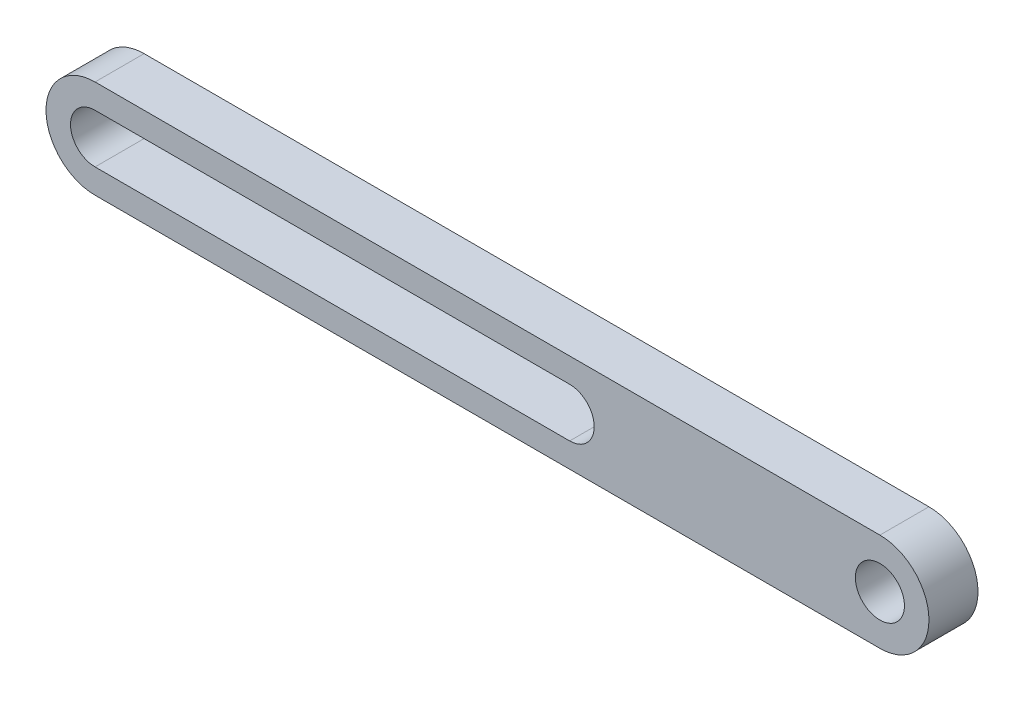
ISO-10303-21;
HEADER;
FILE_DESCRIPTION(('STEP AP214'),'2;1');
FILE_NAME('part.step','',(''),(''),'','','');
FILE_SCHEMA(('AUTOMOTIVE_DESIGN { 1 0 10303 214 1 1 1 1 }'));
ENDSEC;
DATA;
#1=APPLICATION_CONTEXT('core data for automotive mechanical design processes');
#2=APPLICATION_PROTOCOL_DEFINITION('international standard','automotive_design',2000,#1);
#3=PRODUCT_CONTEXT('',#1,'mechanical');
#4=PRODUCT('Part','Part','',(#3));
#5=PRODUCT_RELATED_PRODUCT_CATEGORY('part','',(#4));
#6=PRODUCT_DEFINITION_FORMATION('','',#4);
#7=PRODUCT_DEFINITION_CONTEXT('part definition',#1,'design');
#8=PRODUCT_DEFINITION('design','',#6,#7);
#9=PRODUCT_DEFINITION_SHAPE('','',#8);
#10=(LENGTH_UNIT() NAMED_UNIT(*) SI_UNIT(.MILLI.,.METRE.));
#11=(NAMED_UNIT(*) PLANE_ANGLE_UNIT() SI_UNIT($,.RADIAN.));
#12=(NAMED_UNIT(*) SI_UNIT($,.STERADIAN.) SOLID_ANGLE_UNIT());
#13=UNCERTAINTY_MEASURE_WITH_UNIT(LENGTH_MEASURE(1.E-05),#10,'distance_accuracy_value','');
#14=(GEOMETRIC_REPRESENTATION_CONTEXT(3) GLOBAL_UNCERTAINTY_ASSIGNED_CONTEXT((#13)) GLOBAL_UNIT_ASSIGNED_CONTEXT((#10,
#11,#12)) REPRESENTATION_CONTEXT('',''));
#15=CARTESIAN_POINT('',(0.,0.,0.));
#16=DIRECTION('',(0.,0.,1.));
#17=DIRECTION('',(1.,0.,0.));
#18=AXIS2_PLACEMENT_3D('',#15,#16,#17);
#19=CARTESIAN_POINT('',(0.,-5.,5.));
#20=DIRECTION('',(0.,0.,-1.));
#21=DIRECTION('',(-1.,0.,0.));
#22=AXIS2_PLACEMENT_3D('',#19,#20,#21);
#23=CYLINDRICAL_SURFACE('',#22,5.);
#24=CARTESIAN_POINT('',(0.,-5.,0.));
#25=DIRECTION('',(0.,0.,1.));
#26=DIRECTION('',(1.,0.,0.));
#27=AXIS2_PLACEMENT_3D('',#24,#25,#26);
#28=CIRCLE('',#27,5.);
#29=CARTESIAN_POINT('',(0.,0.,0.));
#30=VERTEX_POINT('',#29);
#31=CARTESIAN_POINT('',(0.,-10.,0.));
#32=VERTEX_POINT('',#31);
#33=EDGE_CURVE('E156',#30,#32,#28,.T.);
#34=ORIENTED_EDGE('',*,*,#33,.T.);
#35=DIRECTION('',(0.,0.,-1.));
#36=VECTOR('',#35,1.);
#37=CARTESIAN_POINT('',(0.,-10.,5.));
#38=LINE('',#37,#36);
#39=CARTESIAN_POINT('',(0.,-10.,5.));
#40=VERTEX_POINT('',#39);
#41=EDGE_CURVE('E179',#40,#32,#38,.T.);
#42=ORIENTED_EDGE('',*,*,#41,.F.);
#43=CARTESIAN_POINT('',(0.,-5.,5.));
#44=DIRECTION('',(0.,0.,1.));
#45=DIRECTION('',(1.,0.,0.));
#46=AXIS2_PLACEMENT_3D('',#43,#44,#45);
#47=CIRCLE('',#46,5.);
#48=CARTESIAN_POINT('',(0.,0.,5.));
#49=VERTEX_POINT('',#48);
#50=EDGE_CURVE('E141',#49,#40,#47,.T.);
#51=ORIENTED_EDGE('',*,*,#50,.F.);
#52=DIRECTION('',(0.,0.,-1.));
#53=VECTOR('',#52,1.);
#54=CARTESIAN_POINT('',(0.,0.,5.));
#55=LINE('',#54,#53);
#56=EDGE_CURVE('E155',#49,#30,#55,.T.);
#57=ORIENTED_EDGE('',*,*,#56,.T.);
#58=EDGE_LOOP('',(#34,#42,#51,#57));
#59=FACE_BOUND('',#58,.T.);
#60=ADVANCED_FACE('F39',(#59),#23,.T.);
#61=CARTESIAN_POINT('',(0.,-10.,5.));
#62=DIRECTION('',(0.,1.,0.));
#63=DIRECTION('',(0.,0.,1.));
#64=AXIS2_PLACEMENT_3D('',#61,#62,#63);
#65=PLANE('',#64);
#66=DIRECTION('',(1.,0.,0.));
#67=VECTOR('',#66,1.);
#68=CARTESIAN_POINT('',(0.,-10.,0.));
#69=LINE('',#68,#67);
#70=CARTESIAN_POINT('',(80.,-10.,0.));
#71=VERTEX_POINT('',#70);
#72=EDGE_CURVE('E160',#32,#71,#69,.T.);
#73=ORIENTED_EDGE('',*,*,#72,.T.);
#74=DIRECTION('',(0.,0.,-1.));
#75=VECTOR('',#74,1.);
#76=CARTESIAN_POINT('',(80.,-10.,5.));
#77=LINE('',#76,#75);
#78=CARTESIAN_POINT('',(80.,-10.,5.));
#79=VERTEX_POINT('',#78);
#80=EDGE_CURVE('E175',#79,#71,#77,.T.);
#81=ORIENTED_EDGE('',*,*,#80,.F.);
#82=DIRECTION('',(1.,0.,0.));
#83=VECTOR('',#82,1.);
#84=CARTESIAN_POINT('',(0.,-10.,5.));
#85=LINE('',#84,#83);
#86=EDGE_CURVE('E145',#40,#79,#85,.T.);
#87=ORIENTED_EDGE('',*,*,#86,.F.);
#88=ORIENTED_EDGE('',*,*,#41,.T.);
#89=EDGE_LOOP('',(#73,#81,#87,#88));
#90=FACE_BOUND('',#89,.T.);
#91=ADVANCED_FACE('F209',(#90),#65,.F.);
#92=CARTESIAN_POINT('',(80.,-5.,5.));
#93=DIRECTION('',(0.,0.,-1.));
#94=DIRECTION('',(-1.,0.,0.));
#95=AXIS2_PLACEMENT_3D('',#92,#93,#94);
#96=CYLINDRICAL_SURFACE('',#95,5.00000000000004);
#97=CARTESIAN_POINT('',(80.,-5.,0.));
#98=DIRECTION('',(0.,0.,1.));
#99=DIRECTION('',(1.,0.,0.));
#100=AXIS2_PLACEMENT_3D('',#97,#98,#99);
#101=CIRCLE('',#100,5.00000000000004);
#102=CARTESIAN_POINT('',(79.9999991385095,0.,0.));
#103=VERTEX_POINT('',#102);
#104=EDGE_CURVE('E163',#71,#103,#101,.T.);
#105=ORIENTED_EDGE('',*,*,#104,.T.);
#106=DIRECTION('',(0.,0.,-1.));
#107=VECTOR('',#106,1.);
#108=CARTESIAN_POINT('',(79.9999991385095,0.,5.));
#109=LINE('',#108,#107);
#110=CARTESIAN_POINT('',(79.9999991385095,0.,5.));
#111=VERTEX_POINT('',#110);
#112=EDGE_CURVE('E171',#111,#103,#109,.T.);
#113=ORIENTED_EDGE('',*,*,#112,.F.);
#114=CARTESIAN_POINT('',(80.,-5.,5.));
#115=DIRECTION('',(0.,0.,1.));
#116=DIRECTION('',(1.,0.,0.));
#117=AXIS2_PLACEMENT_3D('',#114,#115,#116);
#118=CIRCLE('',#117,5.00000000000004);
#119=EDGE_CURVE('E149',#79,#111,#118,.T.);
#120=ORIENTED_EDGE('',*,*,#119,.F.);
#121=ORIENTED_EDGE('',*,*,#80,.T.);
#122=EDGE_LOOP('',(#105,#113,#120,#121));
#123=FACE_BOUND('',#122,.T.);
#124=ADVANCED_FACE('F214',(#123),#96,.T.);
#125=CARTESIAN_POINT('',(0.,0.,5.));
#126=DIRECTION('',(0.,-1.,0.));
#127=DIRECTION('',(0.,0.,-1.));
#128=AXIS2_PLACEMENT_3D('',#125,#126,#127);
#129=PLANE('',#128);
#130=DIRECTION('',(-1.,0.,0.));
#131=VECTOR('',#130,1.);
#132=CARTESIAN_POINT('',(0.,0.,0.));
#133=LINE('',#132,#131);
#134=EDGE_CURVE('E146',#103,#30,#133,.T.);
#135=ORIENTED_EDGE('',*,*,#134,.T.);
#136=ORIENTED_EDGE('',*,*,#56,.F.);
#137=DIRECTION('',(-1.,0.,0.));
#138=VECTOR('',#137,1.);
#139=CARTESIAN_POINT('',(0.,0.,5.));
#140=LINE('',#139,#138);
#141=EDGE_CURVE('E152',#111,#49,#140,.T.);
#142=ORIENTED_EDGE('',*,*,#141,.F.);
#143=ORIENTED_EDGE('',*,*,#112,.T.);
#144=EDGE_LOOP('',(#135,#136,#142,#143));
#145=FACE_BOUND('',#144,.T.);
#146=ADVANCED_FACE('F227',(#145),#129,.F.);
#147=CARTESIAN_POINT('',(0.,-5.,5.));
#148=DIRECTION('',(0.,0.,1.));
#149=DIRECTION('',(1.,0.,0.));
#150=AXIS2_PLACEMENT_3D('',#147,#148,#149);
#151=PLANE('',#150);
#152=CARTESIAN_POINT('',(80.,-5.,5.));
#153=DIRECTION('',(0.,0.,1.));
#154=DIRECTION('',(1.,0.,0.));
#155=AXIS2_PLACEMENT_3D('',#152,#153,#154);
#156=CIRCLE('',#155,2.50000000000001);
#157=CARTESIAN_POINT('',(82.5,-5.,5.));
#158=VERTEX_POINT('',#157);
#159=EDGE_CURVE('E136',#158,#158,#156,.T.);
#160=ORIENTED_EDGE('',*,*,#159,.F.);
#161=EDGE_LOOP('',(#160));
#162=FACE_BOUND('',#161,.T.);
#163=CARTESIAN_POINT('',(0.,-5.,5.));
#164=DIRECTION('',(0.,0.,1.));
#165=DIRECTION('',(1.,0.,0.));
#166=AXIS2_PLACEMENT_3D('',#163,#164,#165);
#167=CIRCLE('',#166,2.5);
#168=CARTESIAN_POINT('',(0.,-2.5,5.));
#169=VERTEX_POINT('',#168);
#170=CARTESIAN_POINT('',(0.,-7.5,5.));
#171=VERTEX_POINT('',#170);
#172=EDGE_CURVE('E55',#169,#171,#167,.T.);
#173=ORIENTED_EDGE('',*,*,#172,.F.);
#174=DIRECTION('',(-1.,0.,0.));
#175=VECTOR('',#174,1.);
#176=CARTESIAN_POINT('',(0.,-2.5,5.));
#177=LINE('',#176,#175);
#178=CARTESIAN_POINT('',(48.3782141015866,-2.5,5.));
#179=VERTEX_POINT('',#178);
#180=EDGE_CURVE('E126',#179,#169,#177,.T.);
#181=ORIENTED_EDGE('',*,*,#180,.F.);
#182=CARTESIAN_POINT('',(48.3782141015866,-5.,5.));
#183=DIRECTION('',(0.,0.,1.));
#184=DIRECTION('',(1.,0.,0.));
#185=AXIS2_PLACEMENT_3D('',#182,#183,#184);
#186=CIRCLE('',#185,2.5);
#187=CARTESIAN_POINT('',(48.3782141015866,-7.5,5.));
#188=VERTEX_POINT('',#187);
#189=EDGE_CURVE('E108',#188,#179,#186,.T.);
#190=ORIENTED_EDGE('',*,*,#189,.F.);
#191=DIRECTION('',(1.,0.,0.));
#192=VECTOR('',#191,1.);
#193=CARTESIAN_POINT('',(0.,-7.5,5.));
#194=LINE('',#193,#192);
#195=EDGE_CURVE('E118',#171,#188,#194,.T.);
#196=ORIENTED_EDGE('',*,*,#195,.F.);
#197=EDGE_LOOP('',(#173,#181,#190,#196));
#198=FACE_BOUND('',#197,.T.);
#199=ORIENTED_EDGE('',*,*,#50,.T.);
#200=ORIENTED_EDGE('',*,*,#86,.T.);
#201=ORIENTED_EDGE('',*,*,#119,.T.);
#202=ORIENTED_EDGE('',*,*,#141,.T.);
#203=EDGE_LOOP('',(#199,#200,#201,#202));
#204=FACE_BOUND('',#203,.T.);
#205=ADVANCED_FACE('F123',(#162,#198,#204),#151,.T.);
#206=CARTESIAN_POINT('',(0.,-5.,0.));
#207=DIRECTION('',(0.,0.,1.));
#208=DIRECTION('',(1.,0.,0.));
#209=AXIS2_PLACEMENT_3D('',#206,#207,#208);
#210=PLANE('',#209);
#211=CARTESIAN_POINT('',(80.,-5.,0.));
#212=DIRECTION('',(0.,0.,1.));
#213=DIRECTION('',(1.,0.,0.));
#214=AXIS2_PLACEMENT_3D('',#211,#212,#213);
#215=CIRCLE('',#214,2.50000000000001);
#216=CARTESIAN_POINT('',(82.5,-5.,0.));
#217=VERTEX_POINT('',#216);
#218=EDGE_CURVE('E42',#217,#217,#215,.T.);
#219=ORIENTED_EDGE('',*,*,#218,.T.);
#220=EDGE_LOOP('',(#219));
#221=FACE_BOUND('',#220,.T.);
#222=DIRECTION('',(-1.,0.,0.));
#223=VECTOR('',#222,1.);
#224=CARTESIAN_POINT('',(0.,-2.5,0.));
#225=LINE('',#224,#223);
#226=CARTESIAN_POINT('',(48.3782141015866,-2.5,0.));
#227=VERTEX_POINT('',#226);
#228=CARTESIAN_POINT('',(0.,-2.5,0.));
#229=VERTEX_POINT('',#228);
#230=EDGE_CURVE('E48',#227,#229,#225,.T.);
#231=ORIENTED_EDGE('',*,*,#230,.T.);
#232=CARTESIAN_POINT('',(0.,-5.,0.));
#233=DIRECTION('',(0.,0.,1.));
#234=DIRECTION('',(1.,0.,0.));
#235=AXIS2_PLACEMENT_3D('',#232,#233,#234);
#236=CIRCLE('',#235,2.5);
#237=CARTESIAN_POINT('',(0.,-7.5,0.));
#238=VERTEX_POINT('',#237);
#239=EDGE_CURVE('E11',#229,#238,#236,.T.);
#240=ORIENTED_EDGE('',*,*,#239,.T.);
#241=DIRECTION('',(1.,0.,0.));
#242=VECTOR('',#241,1.);
#243=CARTESIAN_POINT('',(0.,-7.5,0.));
#244=LINE('',#243,#242);
#245=CARTESIAN_POINT('',(48.3782141015866,-7.5,0.));
#246=VERTEX_POINT('',#245);
#247=EDGE_CURVE('E183',#238,#246,#244,.T.);
#248=ORIENTED_EDGE('',*,*,#247,.T.);
#249=CARTESIAN_POINT('',(48.3782141015866,-5.,0.));
#250=DIRECTION('',(0.,0.,1.));
#251=DIRECTION('',(1.,0.,0.));
#252=AXIS2_PLACEMENT_3D('',#249,#250,#251);
#253=CIRCLE('',#252,2.5);
#254=EDGE_CURVE('E111',#246,#227,#253,.T.);
#255=ORIENTED_EDGE('',*,*,#254,.T.);
#256=EDGE_LOOP('',(#231,#240,#248,#255));
#257=FACE_BOUND('',#256,.T.);
#258=ORIENTED_EDGE('',*,*,#33,.F.);
#259=ORIENTED_EDGE('',*,*,#134,.F.);
#260=ORIENTED_EDGE('',*,*,#104,.F.);
#261=ORIENTED_EDGE('',*,*,#72,.F.);
#262=EDGE_LOOP('',(#258,#259,#260,#261));
#263=FACE_BOUND('',#262,.T.);
#264=ADVANCED_FACE('F191',(#221,#257,#263),#210,.F.);
#265=CARTESIAN_POINT('',(0.,-5.,-10.));
#266=DIRECTION('',(0.,0.,1.));
#267=DIRECTION('',(1.,0.,0.));
#268=AXIS2_PLACEMENT_3D('',#265,#266,#267);
#269=CYLINDRICAL_SURFACE('',#268,2.5);
#270=DIRECTION('',(0.,0.,1.));
#271=VECTOR('',#270,1.);
#272=CARTESIAN_POINT('',(0.,-2.5,-10.));
#273=LINE('',#272,#271);
#274=EDGE_CURVE('E133',#229,#169,#273,.T.);
#275=ORIENTED_EDGE('',*,*,#274,.T.);
#276=ORIENTED_EDGE('',*,*,#172,.T.);
#277=DIRECTION('',(0.,0.,1.));
#278=VECTOR('',#277,1.);
#279=CARTESIAN_POINT('',(0.,-7.5,-10.));
#280=LINE('',#279,#278);
#281=EDGE_CURVE('E115',#238,#171,#280,.T.);
#282=ORIENTED_EDGE('',*,*,#281,.F.);
#283=ORIENTED_EDGE('',*,*,#239,.F.);
#284=EDGE_LOOP('',(#275,#276,#282,#283));
#285=FACE_BOUND('',#284,.T.);
#286=ADVANCED_FACE('F196',(#285),#269,.F.);
#287=CARTESIAN_POINT('',(0.,-2.5,-10.));
#288=DIRECTION('',(0.,1.,0.));
#289=DIRECTION('',(0.,0.,1.));
#290=AXIS2_PLACEMENT_3D('',#287,#288,#289);
#291=PLANE('',#290);
#292=DIRECTION('',(0.,0.,1.));
#293=VECTOR('',#292,1.);
#294=CARTESIAN_POINT('',(48.3782141015866,-2.5,-10.));
#295=LINE('',#294,#293);
#296=EDGE_CURVE('E114',#227,#179,#295,.T.);
#297=ORIENTED_EDGE('',*,*,#296,.T.);
#298=ORIENTED_EDGE('',*,*,#180,.T.);
#299=ORIENTED_EDGE('',*,*,#274,.F.);
#300=ORIENTED_EDGE('',*,*,#230,.F.);
#301=EDGE_LOOP('',(#297,#298,#299,#300));
#302=FACE_BOUND('',#301,.T.);
#303=ADVANCED_FACE('F195',(#302),#291,.F.);
#304=CARTESIAN_POINT('',(48.3782141015866,-5.,-10.));
#305=DIRECTION('',(0.,0.,1.));
#306=DIRECTION('',(1.,0.,0.));
#307=AXIS2_PLACEMENT_3D('',#304,#305,#306);
#308=CYLINDRICAL_SURFACE('',#307,2.5);
#309=DIRECTION('',(0.,0.,1.));
#310=VECTOR('',#309,1.);
#311=CARTESIAN_POINT('',(48.3782141015866,-7.5,-10.));
#312=LINE('',#311,#310);
#313=EDGE_CURVE('E63',#246,#188,#312,.T.);
#314=ORIENTED_EDGE('',*,*,#313,.T.);
#315=ORIENTED_EDGE('',*,*,#189,.T.);
#316=ORIENTED_EDGE('',*,*,#296,.F.);
#317=ORIENTED_EDGE('',*,*,#254,.F.);
#318=EDGE_LOOP('',(#314,#315,#316,#317));
#319=FACE_BOUND('',#318,.T.);
#320=ADVANCED_FACE('F105',(#319),#308,.F.);
#321=CARTESIAN_POINT('',(0.,-7.5,-10.));
#322=DIRECTION('',(0.,-1.,0.));
#323=DIRECTION('',(0.,0.,-1.));
#324=AXIS2_PLACEMENT_3D('',#321,#322,#323);
#325=PLANE('',#324);
#326=ORIENTED_EDGE('',*,*,#281,.T.);
#327=ORIENTED_EDGE('',*,*,#195,.T.);
#328=ORIENTED_EDGE('',*,*,#313,.F.);
#329=ORIENTED_EDGE('',*,*,#247,.F.);
#330=EDGE_LOOP('',(#326,#327,#328,#329));
#331=FACE_BOUND('',#330,.T.);
#332=ADVANCED_FACE('F119',(#331),#325,.F.);
#333=CARTESIAN_POINT('',(80.,-5.,-10.));
#334=DIRECTION('',(0.,0.,1.));
#335=DIRECTION('',(1.,0.,0.));
#336=AXIS2_PLACEMENT_3D('',#333,#334,#335);
#337=CYLINDRICAL_SURFACE('',#336,2.50000000000001);
#338=ORIENTED_EDGE('',*,*,#159,.T.);
#339=EDGE_LOOP('',(#338));
#340=FACE_BOUND('',#339,.T.);
#341=ORIENTED_EDGE('',*,*,#218,.F.);
#342=EDGE_LOOP('',(#341));
#343=FACE_BOUND('',#342,.T.);
#344=ADVANCED_FACE('F249',(#340,#343),#337,.F.);
#345=CLOSED_SHELL('',(#60,#91,#124,#146,#205,#264,#286,#303,#320,#332,#344));
#346=MANIFOLD_SOLID_BREP('B2',#345);
#347=ADVANCED_BREP_SHAPE_REPRESENTATION('',(#18,#346),#14);
#348=SHAPE_DEFINITION_REPRESENTATION(#9,#347);
ENDSEC;
END-ISO-10303-21;
